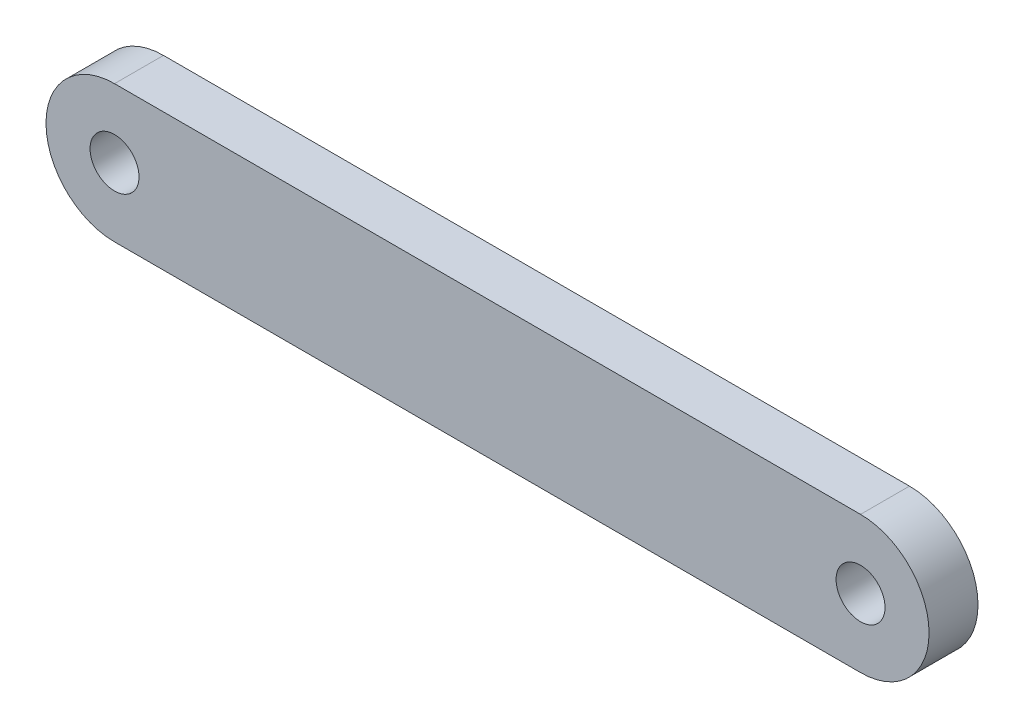
ISO-10303-21;
HEADER;
FILE_DESCRIPTION(('STEP AP214'),'2;1');
FILE_NAME('part.step','',(''),(''),'','','');
FILE_SCHEMA(('AUTOMOTIVE_DESIGN { 1 0 10303 214 1 1 1 1 }'));
ENDSEC;
DATA;
#1=APPLICATION_CONTEXT('core data for automotive mechanical design processes');
#2=APPLICATION_PROTOCOL_DEFINITION('international standard','automotive_design',2000,#1);
#3=PRODUCT_CONTEXT('',#1,'mechanical');
#4=PRODUCT('Part','Part','',(#3));
#5=PRODUCT_RELATED_PRODUCT_CATEGORY('part','',(#4));
#6=PRODUCT_DEFINITION_FORMATION('','',#4);
#7=PRODUCT_DEFINITION_CONTEXT('part definition',#1,'design');
#8=PRODUCT_DEFINITION('design','',#6,#7);
#9=PRODUCT_DEFINITION_SHAPE('','',#8);
#10=(LENGTH_UNIT() NAMED_UNIT(*) SI_UNIT(.MILLI.,.METRE.));
#11=(NAMED_UNIT(*) PLANE_ANGLE_UNIT() SI_UNIT($,.RADIAN.));
#12=(NAMED_UNIT(*) SI_UNIT($,.STERADIAN.) SOLID_ANGLE_UNIT());
#13=UNCERTAINTY_MEASURE_WITH_UNIT(LENGTH_MEASURE(1.E-05),#10,'distance_accuracy_value','');
#14=(GEOMETRIC_REPRESENTATION_CONTEXT(3) GLOBAL_UNCERTAINTY_ASSIGNED_CONTEXT((#13)) GLOBAL_UNIT_ASSIGNED_CONTEXT((#10,
#11,#12)) REPRESENTATION_CONTEXT('',''));
#15=CARTESIAN_POINT('',(0.,0.,0.));
#16=DIRECTION('',(0.,0.,1.));
#17=DIRECTION('',(1.,0.,0.));
#18=AXIS2_PLACEMENT_3D('',#15,#16,#17);
#19=CARTESIAN_POINT('',(47.3437910983488,0.116697774587227,6.35));
#20=DIRECTION('',(0.,0.,-1.));
#21=DIRECTION('',(-1.,0.,0.));
#22=AXIS2_PLACEMENT_3D('',#19,#20,#21);
#23=PLANE('',#22);
#24=CARTESIAN_POINT('',(47.3437910983488,0.116697774587227,6.35));
#25=DIRECTION('',(0.,0.,1.));
#26=DIRECTION('',(-1.,0.,0.));
#27=AXIS2_PLACEMENT_3D('',#24,#25,#26);
#28=CIRCLE('',#27,8.89);
#29=CARTESIAN_POINT('',(47.3437910983488,-8.77330222541277,6.35));
#30=VERTEX_POINT('',#29);
#31=CARTESIAN_POINT('',(47.3437910983488,9.00669777458723,6.35));
#32=VERTEX_POINT('',#31);
#33=EDGE_CURVE('E93',#30,#32,#28,.T.);
#34=ORIENTED_EDGE('',*,*,#33,.T.);
#35=DIRECTION('',(-1.,0.,0.));
#36=VECTOR('',#35,1.);
#37=CARTESIAN_POINT('',(-49.4442089016512,9.00669777458723,6.35));
#38=LINE('',#37,#36);
#39=CARTESIAN_POINT('',(-49.4442089016512,9.00669777458723,6.35));
#40=VERTEX_POINT('',#39);
#41=EDGE_CURVE('E88',#32,#40,#38,.T.);
#42=ORIENTED_EDGE('',*,*,#41,.T.);
#43=CARTESIAN_POINT('',(-49.4442089016512,0.116697774587227,6.35));
#44=DIRECTION('',(0.,0.,1.));
#45=DIRECTION('',(1.,0.,0.));
#46=AXIS2_PLACEMENT_3D('',#43,#44,#45);
#47=CIRCLE('',#46,8.89);
#48=CARTESIAN_POINT('',(-49.4442089016512,-8.77330222541277,6.35));
#49=VERTEX_POINT('',#48);
#50=EDGE_CURVE('E90',#40,#49,#47,.T.);
#51=ORIENTED_EDGE('',*,*,#50,.T.);
#52=DIRECTION('',(1.,0.,0.));
#53=VECTOR('',#52,1.);
#54=CARTESIAN_POINT('',(-49.4442089016512,-8.77330222541277,6.35));
#55=LINE('',#54,#53);
#56=EDGE_CURVE('E57',#49,#30,#55,.T.);
#57=ORIENTED_EDGE('',*,*,#56,.T.);
#58=EDGE_LOOP('',(#34,#42,#51,#57));
#59=FACE_BOUND('',#58,.T.);
#60=CARTESIAN_POINT('',(-49.4442089016512,0.116697774587227,6.35));
#61=DIRECTION('',(0.,0.,1.));
#62=DIRECTION('',(1.,0.,0.));
#63=AXIS2_PLACEMENT_3D('',#60,#61,#62);
#64=CIRCLE('',#63,3.175);
#65=CARTESIAN_POINT('',(-46.2692089016511,0.116697774587227,6.35));
#66=VERTEX_POINT('',#65);
#67=EDGE_CURVE('E106',#66,#66,#64,.T.);
#68=ORIENTED_EDGE('',*,*,#67,.F.);
#69=EDGE_LOOP('',(#68));
#70=FACE_BOUND('',#69,.T.);
#71=CARTESIAN_POINT('',(47.3437910983488,0.116697774587227,6.35));
#72=DIRECTION('',(0.,0.,1.));
#73=DIRECTION('',(1.,0.,0.));
#74=AXIS2_PLACEMENT_3D('',#71,#72,#73);
#75=CIRCLE('',#74,3.175);
#76=CARTESIAN_POINT('',(50.5187910983488,0.116697774587227,6.35));
#77=VERTEX_POINT('',#76);
#78=EDGE_CURVE('E121',#77,#77,#75,.T.);
#79=ORIENTED_EDGE('',*,*,#78,.F.);
#80=EDGE_LOOP('',(#79));
#81=FACE_BOUND('',#80,.T.);
#82=ADVANCED_FACE('F39',(#59,#70,#81),#23,.F.);
#83=CARTESIAN_POINT('',(47.3437910983488,0.116697774587227,0.));
#84=DIRECTION('',(0.,0.,-1.));
#85=DIRECTION('',(-1.,0.,0.));
#86=AXIS2_PLACEMENT_3D('',#83,#84,#85);
#87=PLANE('',#86);
#88=CARTESIAN_POINT('',(-49.4442089016512,0.116697774587227,0.));
#89=DIRECTION('',(0.,0.,1.));
#90=DIRECTION('',(1.,0.,0.));
#91=AXIS2_PLACEMENT_3D('',#88,#89,#90);
#92=CIRCLE('',#91,3.175);
#93=CARTESIAN_POINT('',(-46.2692089016511,0.116697774587227,0.));
#94=VERTEX_POINT('',#93);
#95=EDGE_CURVE('E117',#94,#94,#92,.T.);
#96=ORIENTED_EDGE('',*,*,#95,.T.);
#97=EDGE_LOOP('',(#96));
#98=FACE_BOUND('',#97,.T.);
#99=CARTESIAN_POINT('',(47.3437910983488,0.116697774587227,0.));
#100=DIRECTION('',(0.,0.,1.));
#101=DIRECTION('',(-1.,0.,0.));
#102=AXIS2_PLACEMENT_3D('',#99,#100,#101);
#103=CIRCLE('',#102,8.89);
#104=CARTESIAN_POINT('',(47.3437910983488,-8.77330222541277,0.));
#105=VERTEX_POINT('',#104);
#106=CARTESIAN_POINT('',(47.3437910983488,9.00669777458723,0.));
#107=VERTEX_POINT('',#106);
#108=EDGE_CURVE('E103',#105,#107,#103,.T.);
#109=ORIENTED_EDGE('',*,*,#108,.F.);
#110=DIRECTION('',(1.,0.,0.));
#111=VECTOR('',#110,1.);
#112=CARTESIAN_POINT('',(-49.4442089016512,-8.77330222541277,0.));
#113=LINE('',#112,#111);
#114=CARTESIAN_POINT('',(-49.4442089016512,-8.77330222541277,0.));
#115=VERTEX_POINT('',#114);
#116=EDGE_CURVE('E80',#115,#105,#113,.T.);
#117=ORIENTED_EDGE('',*,*,#116,.F.);
#118=CARTESIAN_POINT('',(-49.4442089016512,0.116697774587227,0.));
#119=DIRECTION('',(0.,0.,1.));
#120=DIRECTION('',(1.,0.,0.));
#121=AXIS2_PLACEMENT_3D('',#118,#119,#120);
#122=CIRCLE('',#121,8.89);
#123=CARTESIAN_POINT('',(-49.4442089016512,9.00669777458723,0.));
#124=VERTEX_POINT('',#123);
#125=EDGE_CURVE('E71',#124,#115,#122,.T.);
#126=ORIENTED_EDGE('',*,*,#125,.F.);
#127=DIRECTION('',(-1.,0.,0.));
#128=VECTOR('',#127,1.);
#129=CARTESIAN_POINT('',(-49.4442089016512,9.00669777458723,0.));
#130=LINE('',#129,#128);
#131=EDGE_CURVE('E92',#107,#124,#130,.T.);
#132=ORIENTED_EDGE('',*,*,#131,.F.);
#133=EDGE_LOOP('',(#109,#117,#126,#132));
#134=FACE_BOUND('',#133,.T.);
#135=CARTESIAN_POINT('',(47.3437910983488,0.116697774587227,0.));
#136=DIRECTION('',(0.,0.,1.));
#137=DIRECTION('',(1.,0.,0.));
#138=AXIS2_PLACEMENT_3D('',#135,#136,#137);
#139=CIRCLE('',#138,3.175);
#140=CARTESIAN_POINT('',(50.5187910983488,0.116697774587227,0.));
#141=VERTEX_POINT('',#140);
#142=EDGE_CURVE('E122',#141,#141,#139,.T.);
#143=ORIENTED_EDGE('',*,*,#142,.T.);
#144=EDGE_LOOP('',(#143));
#145=FACE_BOUND('',#144,.T.);
#146=ADVANCED_FACE('F111',(#98,#134,#145),#87,.T.);
#147=CARTESIAN_POINT('',(47.3437910983488,0.116697774587227,6.35));
#148=DIRECTION('',(0.,0.,-1.));
#149=DIRECTION('',(-1.,0.,0.));
#150=AXIS2_PLACEMENT_3D('',#147,#148,#149);
#151=CYLINDRICAL_SURFACE('',#150,8.89);
#152=ORIENTED_EDGE('',*,*,#108,.T.);
#153=DIRECTION('',(0.,0.,-1.));
#154=VECTOR('',#153,1.);
#155=CARTESIAN_POINT('',(47.3437910983488,9.00669777458723,6.35));
#156=LINE('',#155,#154);
#157=EDGE_CURVE('E11',#32,#107,#156,.T.);
#158=ORIENTED_EDGE('',*,*,#157,.F.);
#159=ORIENTED_EDGE('',*,*,#33,.F.);
#160=DIRECTION('',(0.,0.,-1.));
#161=VECTOR('',#160,1.);
#162=CARTESIAN_POINT('',(47.3437910983488,-8.77330222541277,6.35));
#163=LINE('',#162,#161);
#164=EDGE_CURVE('E97',#30,#105,#163,.T.);
#165=ORIENTED_EDGE('',*,*,#164,.T.);
#166=EDGE_LOOP('',(#152,#158,#159,#165));
#167=FACE_BOUND('',#166,.T.);
#168=ADVANCED_FACE('F41',(#167),#151,.T.);
#169=CARTESIAN_POINT('',(-49.4442089016512,9.00669777458723,6.35));
#170=DIRECTION('',(0.,-1.,0.));
#171=DIRECTION('',(0.,0.,-1.));
#172=AXIS2_PLACEMENT_3D('',#169,#170,#171);
#173=PLANE('',#172);
#174=ORIENTED_EDGE('',*,*,#131,.T.);
#175=DIRECTION('',(0.,0.,-1.));
#176=VECTOR('',#175,1.);
#177=CARTESIAN_POINT('',(-49.4442089016512,9.00669777458723,6.35));
#178=LINE('',#177,#176);
#179=EDGE_CURVE('E48',#40,#124,#178,.T.);
#180=ORIENTED_EDGE('',*,*,#179,.F.);
#181=ORIENTED_EDGE('',*,*,#41,.F.);
#182=ORIENTED_EDGE('',*,*,#157,.T.);
#183=EDGE_LOOP('',(#174,#180,#181,#182));
#184=FACE_BOUND('',#183,.T.);
#185=ADVANCED_FACE('F94',(#184),#173,.F.);
#186=CARTESIAN_POINT('',(-49.4442089016512,0.116697774587227,6.35));
#187=DIRECTION('',(0.,0.,-1.));
#188=DIRECTION('',(-1.,0.,0.));
#189=AXIS2_PLACEMENT_3D('',#186,#187,#188);
#190=CYLINDRICAL_SURFACE('',#189,8.89);
#191=ORIENTED_EDGE('',*,*,#125,.T.);
#192=DIRECTION('',(0.,0.,-1.));
#193=VECTOR('',#192,1.);
#194=CARTESIAN_POINT('',(-49.4442089016512,-8.77330222541277,6.35));
#195=LINE('',#194,#193);
#196=EDGE_CURVE('E96',#49,#115,#195,.T.);
#197=ORIENTED_EDGE('',*,*,#196,.F.);
#198=ORIENTED_EDGE('',*,*,#50,.F.);
#199=ORIENTED_EDGE('',*,*,#179,.T.);
#200=EDGE_LOOP('',(#191,#197,#198,#199));
#201=FACE_BOUND('',#200,.T.);
#202=ADVANCED_FACE('F100',(#201),#190,.T.);
#203=CARTESIAN_POINT('',(-49.4442089016512,-8.77330222541277,6.35));
#204=DIRECTION('',(0.,1.,0.));
#205=DIRECTION('',(0.,0.,1.));
#206=AXIS2_PLACEMENT_3D('',#203,#204,#205);
#207=PLANE('',#206);
#208=ORIENTED_EDGE('',*,*,#116,.T.);
#209=ORIENTED_EDGE('',*,*,#164,.F.);
#210=ORIENTED_EDGE('',*,*,#56,.F.);
#211=ORIENTED_EDGE('',*,*,#196,.T.);
#212=EDGE_LOOP('',(#208,#209,#210,#211));
#213=FACE_BOUND('',#212,.T.);
#214=ADVANCED_FACE('F112',(#213),#207,.F.);
#215=CARTESIAN_POINT('',(-49.4442089016512,0.116697774587227,6.35));
#216=DIRECTION('',(0.,0.,-1.));
#217=DIRECTION('',(-1.,0.,0.));
#218=AXIS2_PLACEMENT_3D('',#215,#216,#217);
#219=CYLINDRICAL_SURFACE('',#218,3.175);
#220=ORIENTED_EDGE('',*,*,#67,.T.);
#221=EDGE_LOOP('',(#220));
#222=FACE_BOUND('',#221,.T.);
#223=ORIENTED_EDGE('',*,*,#95,.F.);
#224=EDGE_LOOP('',(#223));
#225=FACE_BOUND('',#224,.T.);
#226=ADVANCED_FACE('F143',(#222,#225),#219,.F.);
#227=CARTESIAN_POINT('',(47.3437910983488,0.116697774587227,6.35));
#228=DIRECTION('',(0.,0.,-1.));
#229=DIRECTION('',(-1.,0.,0.));
#230=AXIS2_PLACEMENT_3D('',#227,#228,#229);
#231=CYLINDRICAL_SURFACE('',#230,3.175);
#232=ORIENTED_EDGE('',*,*,#78,.T.);
#233=EDGE_LOOP('',(#232));
#234=FACE_BOUND('',#233,.T.);
#235=ORIENTED_EDGE('',*,*,#142,.F.);
#236=EDGE_LOOP('',(#235));
#237=FACE_BOUND('',#236,.T.);
#238=ADVANCED_FACE('F128',(#234,#237),#231,.F.);
#239=CLOSED_SHELL('',(#82,#146,#168,#185,#202,#214,#226,#238));
#240=MANIFOLD_SOLID_BREP('B2',#239);
#241=ADVANCED_BREP_SHAPE_REPRESENTATION('',(#18,#240),#14);
#242=SHAPE_DEFINITION_REPRESENTATION(#9,#241);
ENDSEC;
END-ISO-10303-21;
